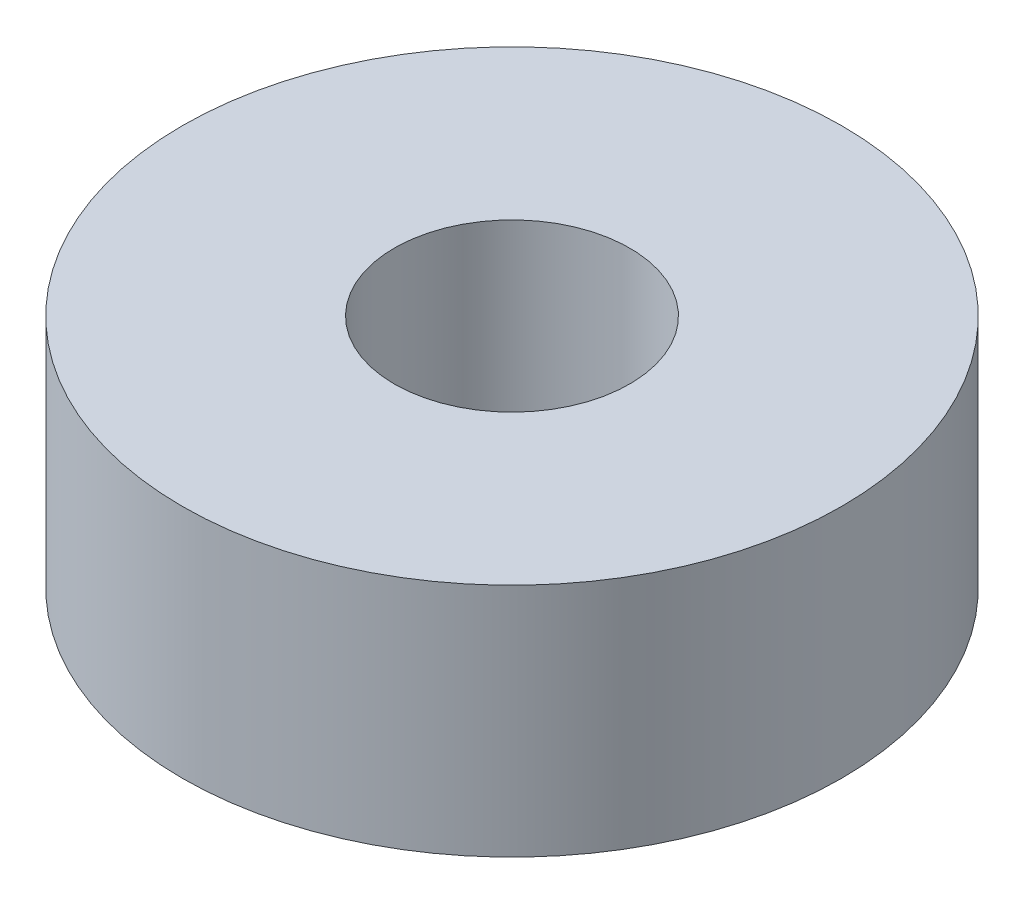
ISO-10303-21;
HEADER;
FILE_DESCRIPTION(('STEP AP214'),'2;1');
FILE_NAME('part.step','',(''),(''),'','','');
FILE_SCHEMA(('AUTOMOTIVE_DESIGN { 1 0 10303 214 1 1 1 1 }'));
ENDSEC;
DATA;
#1=APPLICATION_CONTEXT('core data for automotive mechanical design processes');
#2=APPLICATION_PROTOCOL_DEFINITION('international standard','automotive_design',2000,#1);
#3=PRODUCT_CONTEXT('',#1,'mechanical');
#4=PRODUCT('Part','Part','',(#3));
#5=PRODUCT_RELATED_PRODUCT_CATEGORY('part','',(#4));
#6=PRODUCT_DEFINITION_FORMATION('','',#4);
#7=PRODUCT_DEFINITION_CONTEXT('part definition',#1,'design');
#8=PRODUCT_DEFINITION('design','',#6,#7);
#9=PRODUCT_DEFINITION_SHAPE('','',#8);
#10=(LENGTH_UNIT() NAMED_UNIT(*) SI_UNIT(.MILLI.,.METRE.));
#11=(NAMED_UNIT(*) PLANE_ANGLE_UNIT() SI_UNIT($,.RADIAN.));
#12=(NAMED_UNIT(*) SI_UNIT($,.STERADIAN.) SOLID_ANGLE_UNIT());
#13=UNCERTAINTY_MEASURE_WITH_UNIT(LENGTH_MEASURE(1.E-05),#10,'distance_accuracy_value','');
#14=(GEOMETRIC_REPRESENTATION_CONTEXT(3) GLOBAL_UNCERTAINTY_ASSIGNED_CONTEXT((#13)) GLOBAL_UNIT_ASSIGNED_CONTEXT((#10,
#11,#12)) REPRESENTATION_CONTEXT('',''));
#15=CARTESIAN_POINT('',(0.,0.,0.));
#16=DIRECTION('',(0.,0.,1.));
#17=DIRECTION('',(1.,0.,0.));
#18=AXIS2_PLACEMENT_3D('',#15,#16,#17);
#19=CARTESIAN_POINT('',(0.,5.,0.));
#20=DIRECTION('',(0.,1.,0.));
#21=DIRECTION('',(0.,0.,1.));
#22=AXIS2_PLACEMENT_3D('',#19,#20,#21);
#23=PLANE('',#22);
#24=CARTESIAN_POINT('',(0.,5.,0.));
#25=DIRECTION('',(0.,1.,0.));
#26=DIRECTION('',(0.,0.,1.));
#27=AXIS2_PLACEMENT_3D('',#24,#25,#26);
#28=CIRCLE('',#27,7.);
#29=CARTESIAN_POINT('',(0.,5.,7.));
#30=VERTEX_POINT('',#29);
#31=EDGE_CURVE('E10',#30,#30,#28,.T.);
#32=ORIENTED_EDGE('',*,*,#31,.T.);
#33=EDGE_LOOP('',(#32));
#34=FACE_BOUND('',#33,.T.);
#35=CARTESIAN_POINT('',(0.,5.,0.));
#36=DIRECTION('',(0.,1.,0.));
#37=DIRECTION('',(0.,0.,1.));
#38=AXIS2_PLACEMENT_3D('',#35,#36,#37);
#39=CIRCLE('',#38,2.5);
#40=CARTESIAN_POINT('',(0.,5.,2.5));
#41=VERTEX_POINT('',#40);
#42=EDGE_CURVE('E42',#41,#41,#39,.T.);
#43=ORIENTED_EDGE('',*,*,#42,.F.);
#44=EDGE_LOOP('',(#43));
#45=FACE_BOUND('',#44,.T.);
#46=ADVANCED_FACE('F31',(#34,#45),#23,.T.);
#47=CARTESIAN_POINT('',(0.,0.,0.));
#48=DIRECTION('',(0.,1.,0.));
#49=DIRECTION('',(0.,0.,1.));
#50=AXIS2_PLACEMENT_3D('',#47,#48,#49);
#51=PLANE('',#50);
#52=CARTESIAN_POINT('',(0.,0.,0.));
#53=DIRECTION('',(0.,1.,0.));
#54=DIRECTION('',(0.,0.,1.));
#55=AXIS2_PLACEMENT_3D('',#52,#53,#54);
#56=CIRCLE('',#55,7.);
#57=CARTESIAN_POINT('',(0.,0.,7.));
#58=VERTEX_POINT('',#57);
#59=EDGE_CURVE('E35',#58,#58,#56,.T.);
#60=ORIENTED_EDGE('',*,*,#59,.F.);
#61=EDGE_LOOP('',(#60));
#62=FACE_BOUND('',#61,.T.);
#63=CARTESIAN_POINT('',(0.,0.,0.));
#64=DIRECTION('',(0.,1.,0.));
#65=DIRECTION('',(0.,0.,1.));
#66=AXIS2_PLACEMENT_3D('',#63,#64,#65);
#67=CIRCLE('',#66,2.5);
#68=CARTESIAN_POINT('',(0.,0.,2.5));
#69=VERTEX_POINT('',#68);
#70=EDGE_CURVE('E44',#69,#69,#67,.T.);
#71=ORIENTED_EDGE('',*,*,#70,.T.);
#72=EDGE_LOOP('',(#71));
#73=FACE_BOUND('',#72,.T.);
#74=ADVANCED_FACE('F54',(#62,#73),#51,.F.);
#75=CARTESIAN_POINT('',(0.,5.,0.));
#76=DIRECTION('',(0.,-1.,0.));
#77=DIRECTION('',(0.,0.,-1.));
#78=AXIS2_PLACEMENT_3D('',#75,#76,#77);
#79=CYLINDRICAL_SURFACE('',#78,7.);
#80=ORIENTED_EDGE('',*,*,#31,.F.);
#81=EDGE_LOOP('',(#80));
#82=FACE_BOUND('',#81,.T.);
#83=ORIENTED_EDGE('',*,*,#59,.T.);
#84=EDGE_LOOP('',(#83));
#85=FACE_BOUND('',#84,.T.);
#86=ADVANCED_FACE('F33',(#82,#85),#79,.T.);
#87=CARTESIAN_POINT('',(0.,5.,0.));
#88=DIRECTION('',(0.,-1.,0.));
#89=DIRECTION('',(0.,0.,-1.));
#90=AXIS2_PLACEMENT_3D('',#87,#88,#89);
#91=CYLINDRICAL_SURFACE('',#90,2.5);
#92=ORIENTED_EDGE('',*,*,#42,.T.);
#93=EDGE_LOOP('',(#92));
#94=FACE_BOUND('',#93,.T.);
#95=ORIENTED_EDGE('',*,*,#70,.F.);
#96=EDGE_LOOP('',(#95));
#97=FACE_BOUND('',#96,.T.);
#98=ADVANCED_FACE('F50',(#94,#97),#91,.F.);
#99=CLOSED_SHELL('',(#46,#74,#86,#98));
#100=MANIFOLD_SOLID_BREP('B2',#99);
#101=ADVANCED_BREP_SHAPE_REPRESENTATION('',(#18,#100),#14);
#102=SHAPE_DEFINITION_REPRESENTATION(#9,#101);
ENDSEC;
END-ISO-10303-21;
